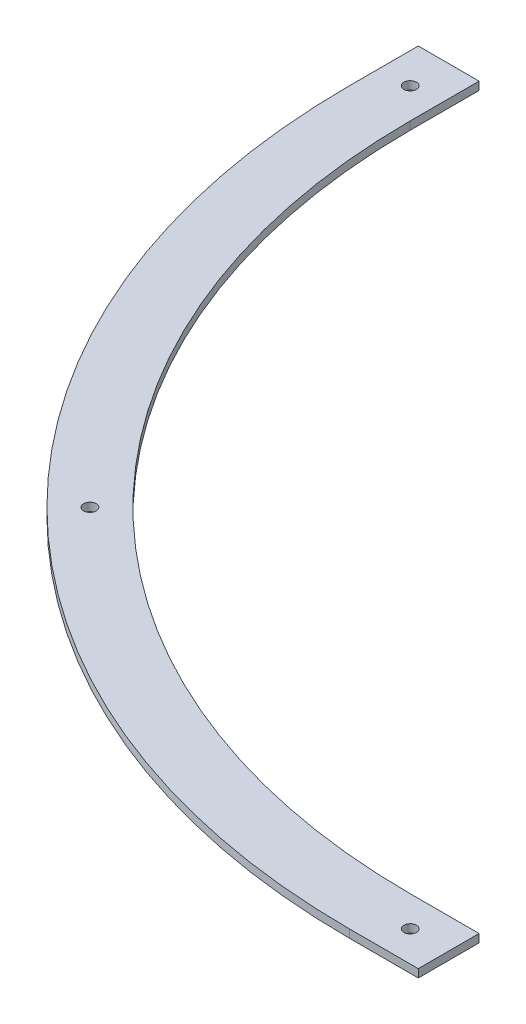
ISO-10303-21;
HEADER;
FILE_DESCRIPTION(('STEP AP214'),'2;1');
FILE_NAME('part.step','',(''),(''),'','','');
FILE_SCHEMA(('AUTOMOTIVE_DESIGN { 1 0 10303 214 1 1 1 1 }'));
ENDSEC;
DATA;
#1=APPLICATION_CONTEXT('core data for automotive mechanical design processes');
#2=APPLICATION_PROTOCOL_DEFINITION('international standard','automotive_design',2000,#1);
#3=PRODUCT_CONTEXT('',#1,'mechanical');
#4=PRODUCT('Part','Part','',(#3));
#5=PRODUCT_RELATED_PRODUCT_CATEGORY('part','',(#4));
#6=PRODUCT_DEFINITION_FORMATION('','',#4);
#7=PRODUCT_DEFINITION_CONTEXT('part definition',#1,'design');
#8=PRODUCT_DEFINITION('design','',#6,#7);
#9=PRODUCT_DEFINITION_SHAPE('','',#8);
#10=(LENGTH_UNIT() NAMED_UNIT(*) SI_UNIT(.MILLI.,.METRE.));
#11=(NAMED_UNIT(*) PLANE_ANGLE_UNIT() SI_UNIT($,.RADIAN.));
#12=(NAMED_UNIT(*) SI_UNIT($,.STERADIAN.) SOLID_ANGLE_UNIT());
#13=UNCERTAINTY_MEASURE_WITH_UNIT(LENGTH_MEASURE(1.E-05),#10,'distance_accuracy_value','');
#14=(GEOMETRIC_REPRESENTATION_CONTEXT(3) GLOBAL_UNCERTAINTY_ASSIGNED_CONTEXT((#13)) GLOBAL_UNIT_ASSIGNED_CONTEXT((#10,
#11,#12)) REPRESENTATION_CONTEXT('',''));
#15=CARTESIAN_POINT('',(0.,0.,0.));
#16=DIRECTION('',(0.,0.,1.));
#17=DIRECTION('',(1.,0.,0.));
#18=AXIS2_PLACEMENT_3D('',#15,#16,#17);
#19=CARTESIAN_POINT('',(90.,2.,-90.));
#20=DIRECTION('',(0.,1.,0.));
#21=DIRECTION('',(0.,0.,1.));
#22=AXIS2_PLACEMENT_3D('',#19,#20,#21);
#23=PLANE('',#22);
#24=CARTESIAN_POINT('',(97.5,2.,82.5));
#25=DIRECTION('',(0.,1.,0.));
#26=DIRECTION('',(0.,0.,1.));
#27=AXIS2_PLACEMENT_3D('',#24,#25,#26);
#28=CIRCLE('',#27,1.54999999999999);
#29=CARTESIAN_POINT('',(97.5,2.,84.05));
#30=VERTEX_POINT('',#29);
#31=EDGE_CURVE('E185',#30,#30,#28,.T.);
#32=ORIENTED_EDGE('',*,*,#31,.F.);
#33=EDGE_LOOP('',(#32));
#34=FACE_BOUND('',#33,.T.);
#35=CARTESIAN_POINT('',(90.,2.,-90.));
#36=DIRECTION('',(0.,1.,0.));
#37=DIRECTION('',(0.,0.,1.));
#38=AXIS2_PLACEMENT_3D('',#35,#36,#37);
#39=CIRCLE('',#38,180.);
#40=CARTESIAN_POINT('',(-90.,2.,-90.));
#41=VERTEX_POINT('',#40);
#42=CARTESIAN_POINT('',(90.,2.,90.));
#43=VERTEX_POINT('',#42);
#44=EDGE_CURVE('E148',#41,#43,#39,.T.);
#45=ORIENTED_EDGE('',*,*,#44,.T.);
#46=DIRECTION('',(1.,0.,0.));
#47=VECTOR('',#46,1.);
#48=CARTESIAN_POINT('',(90.,2.,90.));
#49=LINE('',#48,#47);
#50=CARTESIAN_POINT('',(107.,2.,90.));
#51=VERTEX_POINT('',#50);
#52=EDGE_CURVE('E96',#43,#51,#49,.T.);
#53=ORIENTED_EDGE('',*,*,#52,.T.);
#54=DIRECTION('',(0.,0.,-1.));
#55=VECTOR('',#54,1.);
#56=CARTESIAN_POINT('',(107.,2.,75.));
#57=LINE('',#56,#55);
#58=CARTESIAN_POINT('',(107.,2.,75.));
#59=VERTEX_POINT('',#58);
#60=EDGE_CURVE('E163',#51,#59,#57,.T.);
#61=ORIENTED_EDGE('',*,*,#60,.T.);
#62=DIRECTION('',(-1.,0.,0.));
#63=VECTOR('',#62,1.);
#64=CARTESIAN_POINT('',(90.,2.,75.));
#65=LINE('',#64,#63);
#66=CARTESIAN_POINT('',(90.,2.,75.));
#67=VERTEX_POINT('',#66);
#68=EDGE_CURVE('E176',#59,#67,#65,.T.);
#69=ORIENTED_EDGE('',*,*,#68,.T.);
#70=CARTESIAN_POINT('',(90.,2.,-90.));
#71=DIRECTION('',(0.,-1.,0.));
#72=DIRECTION('',(0.,0.,1.));
#73=AXIS2_PLACEMENT_3D('',#70,#71,#72);
#74=CIRCLE('',#73,165.);
#75=CARTESIAN_POINT('',(-75.,2.,-90.));
#76=VERTEX_POINT('',#75);
#77=EDGE_CURVE('E115',#67,#76,#74,.T.);
#78=ORIENTED_EDGE('',*,*,#77,.T.);
#79=DIRECTION('',(0.,0.,-1.));
#80=VECTOR('',#79,1.);
#81=CARTESIAN_POINT('',(-75.,2.,-90.));
#82=LINE('',#81,#80);
#83=CARTESIAN_POINT('',(-75.,2.,-107.));
#84=VERTEX_POINT('',#83);
#85=EDGE_CURVE('E109',#76,#84,#82,.T.);
#86=ORIENTED_EDGE('',*,*,#85,.T.);
#87=DIRECTION('',(-1.,0.,0.));
#88=VECTOR('',#87,1.);
#89=CARTESIAN_POINT('',(-90.,2.,-107.));
#90=LINE('',#89,#88);
#91=CARTESIAN_POINT('',(-90.,2.,-107.));
#92=VERTEX_POINT('',#91);
#93=EDGE_CURVE('E113',#84,#92,#90,.T.);
#94=ORIENTED_EDGE('',*,*,#93,.T.);
#95=DIRECTION('',(0.,0.,1.));
#96=VECTOR('',#95,1.);
#97=CARTESIAN_POINT('',(-90.,2.,-90.));
#98=LINE('',#97,#96);
#99=EDGE_CURVE('E53',#92,#41,#98,.T.);
#100=ORIENTED_EDGE('',*,*,#99,.T.);
#101=EDGE_LOOP('',(#45,#53,#61,#69,#78,#86,#94,#100));
#102=FACE_BOUND('',#101,.T.);
#103=CARTESIAN_POINT('',(-82.5,2.,-97.5));
#104=DIRECTION('',(0.,1.,0.));
#105=DIRECTION('',(0.,0.,1.));
#106=AXIS2_PLACEMENT_3D('',#103,#104,#105);
#107=CIRCLE('',#106,1.54999999999999);
#108=CARTESIAN_POINT('',(-82.5,2.,-95.95));
#109=VERTEX_POINT('',#108);
#110=EDGE_CURVE('E137',#109,#109,#107,.T.);
#111=ORIENTED_EDGE('',*,*,#110,.F.);
#112=EDGE_LOOP('',(#111));
#113=FACE_BOUND('',#112,.T.);
#114=CARTESIAN_POINT('',(-31.9759197546794,2.,31.9759197546794));
#115=DIRECTION('',(0.,1.,0.));
#116=DIRECTION('',(0.,0.,1.));
#117=AXIS2_PLACEMENT_3D('',#114,#115,#116);
#118=CIRCLE('',#117,1.54999999999999);
#119=CARTESIAN_POINT('',(-31.9759197546794,2.,33.5259197546794));
#120=VERTEX_POINT('',#119);
#121=EDGE_CURVE('E191',#120,#120,#118,.T.);
#122=ORIENTED_EDGE('',*,*,#121,.F.);
#123=EDGE_LOOP('',(#122));
#124=FACE_BOUND('',#123,.T.);
#125=ADVANCED_FACE('F36',(#34,#102,#113,#124),#23,.T.);
#126=CARTESIAN_POINT('',(90.,0.,-90.));
#127=DIRECTION('',(0.,1.,0.));
#128=DIRECTION('',(0.,0.,1.));
#129=AXIS2_PLACEMENT_3D('',#126,#127,#128);
#130=PLANE('',#129);
#131=CARTESIAN_POINT('',(90.,0.,-90.));
#132=DIRECTION('',(0.,1.,0.));
#133=DIRECTION('',(0.,0.,1.));
#134=AXIS2_PLACEMENT_3D('',#131,#132,#133);
#135=CIRCLE('',#134,180.);
#136=CARTESIAN_POINT('',(-90.,0.,-90.));
#137=VERTEX_POINT('',#136);
#138=CARTESIAN_POINT('',(90.,0.,90.));
#139=VERTEX_POINT('',#138);
#140=EDGE_CURVE('E133',#137,#139,#135,.T.);
#141=ORIENTED_EDGE('',*,*,#140,.F.);
#142=DIRECTION('',(0.,0.,1.));
#143=VECTOR('',#142,1.);
#144=CARTESIAN_POINT('',(-90.,0.,-90.));
#145=LINE('',#144,#143);
#146=CARTESIAN_POINT('',(-90.,0.,-107.));
#147=VERTEX_POINT('',#146);
#148=EDGE_CURVE('E88',#147,#137,#145,.T.);
#149=ORIENTED_EDGE('',*,*,#148,.F.);
#150=DIRECTION('',(-1.,0.,0.));
#151=VECTOR('',#150,1.);
#152=CARTESIAN_POINT('',(-90.,0.,-107.));
#153=LINE('',#152,#151);
#154=CARTESIAN_POINT('',(-75.,0.,-107.));
#155=VERTEX_POINT('',#154);
#156=EDGE_CURVE('E82',#155,#147,#153,.T.);
#157=ORIENTED_EDGE('',*,*,#156,.F.);
#158=DIRECTION('',(0.,0.,-1.));
#159=VECTOR('',#158,1.);
#160=CARTESIAN_POINT('',(-75.,0.,-90.));
#161=LINE('',#160,#159);
#162=CARTESIAN_POINT('',(-75.,0.,-90.));
#163=VERTEX_POINT('',#162);
#164=EDGE_CURVE('E123',#163,#155,#161,.T.);
#165=ORIENTED_EDGE('',*,*,#164,.F.);
#166=CARTESIAN_POINT('',(90.,0.,-90.));
#167=DIRECTION('',(0.,-1.,0.));
#168=DIRECTION('',(0.,0.,1.));
#169=AXIS2_PLACEMENT_3D('',#166,#167,#168);
#170=CIRCLE('',#169,165.);
#171=CARTESIAN_POINT('',(90.,0.,75.));
#172=VERTEX_POINT('',#171);
#173=EDGE_CURVE('E143',#172,#163,#170,.T.);
#174=ORIENTED_EDGE('',*,*,#173,.F.);
#175=DIRECTION('',(-1.,0.,0.));
#176=VECTOR('',#175,1.);
#177=CARTESIAN_POINT('',(90.,0.,75.));
#178=LINE('',#177,#176);
#179=CARTESIAN_POINT('',(107.,0.,75.));
#180=VERTEX_POINT('',#179);
#181=EDGE_CURVE('E141',#180,#172,#178,.T.);
#182=ORIENTED_EDGE('',*,*,#181,.F.);
#183=DIRECTION('',(0.,0.,-1.));
#184=VECTOR('',#183,1.);
#185=CARTESIAN_POINT('',(107.,0.,75.));
#186=LINE('',#185,#184);
#187=CARTESIAN_POINT('',(107.,0.,90.));
#188=VERTEX_POINT('',#187);
#189=EDGE_CURVE('E139',#188,#180,#186,.T.);
#190=ORIENTED_EDGE('',*,*,#189,.F.);
#191=DIRECTION('',(1.,0.,0.));
#192=VECTOR('',#191,1.);
#193=CARTESIAN_POINT('',(90.,0.,90.));
#194=LINE('',#193,#192);
#195=EDGE_CURVE('E136',#139,#188,#194,.T.);
#196=ORIENTED_EDGE('',*,*,#195,.F.);
#197=EDGE_LOOP('',(#141,#149,#157,#165,#174,#182,#190,#196));
#198=FACE_BOUND('',#197,.T.);
#199=CARTESIAN_POINT('',(-82.5,0.,-97.5));
#200=DIRECTION('',(0.,1.,0.));
#201=DIRECTION('',(0.,0.,1.));
#202=AXIS2_PLACEMENT_3D('',#199,#200,#201);
#203=CIRCLE('',#202,1.54999999999999);
#204=CARTESIAN_POINT('',(-82.5,0.,-95.95));
#205=VERTEX_POINT('',#204);
#206=EDGE_CURVE('E182',#205,#205,#203,.T.);
#207=ORIENTED_EDGE('',*,*,#206,.T.);
#208=EDGE_LOOP('',(#207));
#209=FACE_BOUND('',#208,.T.);
#210=CARTESIAN_POINT('',(97.5,0.,82.5));
#211=DIRECTION('',(0.,1.,0.));
#212=DIRECTION('',(0.,0.,1.));
#213=AXIS2_PLACEMENT_3D('',#210,#211,#212);
#214=CIRCLE('',#213,1.54999999999999);
#215=CARTESIAN_POINT('',(97.5,0.,84.05));
#216=VERTEX_POINT('',#215);
#217=EDGE_CURVE('E188',#216,#216,#214,.T.);
#218=ORIENTED_EDGE('',*,*,#217,.T.);
#219=EDGE_LOOP('',(#218));
#220=FACE_BOUND('',#219,.T.);
#221=CARTESIAN_POINT('',(-31.9759197546794,0.,31.9759197546794));
#222=DIRECTION('',(0.,1.,0.));
#223=DIRECTION('',(0.,0.,1.));
#224=AXIS2_PLACEMENT_3D('',#221,#222,#223);
#225=CIRCLE('',#224,1.54999999999999);
#226=CARTESIAN_POINT('',(-31.9759197546794,0.,33.5259197546794));
#227=VERTEX_POINT('',#226);
#228=EDGE_CURVE('E194',#227,#227,#225,.T.);
#229=ORIENTED_EDGE('',*,*,#228,.T.);
#230=EDGE_LOOP('',(#229));
#231=FACE_BOUND('',#230,.T.);
#232=ADVANCED_FACE('F167',(#198,#209,#220,#231),#130,.F.);
#233=CARTESIAN_POINT('',(90.,2.,-90.));
#234=DIRECTION('',(0.,-1.,0.));
#235=DIRECTION('',(0.,0.,-1.));
#236=AXIS2_PLACEMENT_3D('',#233,#234,#235);
#237=CYLINDRICAL_SURFACE('',#236,180.);
#238=ORIENTED_EDGE('',*,*,#140,.T.);
#239=DIRECTION('',(0.,-1.,0.));
#240=VECTOR('',#239,1.);
#241=CARTESIAN_POINT('',(90.,2.,90.));
#242=LINE('',#241,#240);
#243=EDGE_CURVE('E11',#43,#139,#242,.T.);
#244=ORIENTED_EDGE('',*,*,#243,.F.);
#245=ORIENTED_EDGE('',*,*,#44,.F.);
#246=DIRECTION('',(0.,-1.,0.));
#247=VECTOR('',#246,1.);
#248=CARTESIAN_POINT('',(-90.,2.,-90.));
#249=LINE('',#248,#247);
#250=EDGE_CURVE('E129',#41,#137,#249,.T.);
#251=ORIENTED_EDGE('',*,*,#250,.T.);
#252=EDGE_LOOP('',(#238,#244,#245,#251));
#253=FACE_BOUND('',#252,.T.);
#254=ADVANCED_FACE('F38',(#253),#237,.T.);
#255=CARTESIAN_POINT('',(90.,2.,90.));
#256=DIRECTION('',(0.,0.,-1.));
#257=DIRECTION('',(-1.,0.,0.));
#258=AXIS2_PLACEMENT_3D('',#255,#256,#257);
#259=PLANE('',#258);
#260=ORIENTED_EDGE('',*,*,#195,.T.);
#261=DIRECTION('',(0.,-1.,0.));
#262=VECTOR('',#261,1.);
#263=CARTESIAN_POINT('',(107.,2.,90.));
#264=LINE('',#263,#262);
#265=EDGE_CURVE('E45',#51,#188,#264,.T.);
#266=ORIENTED_EDGE('',*,*,#265,.F.);
#267=ORIENTED_EDGE('',*,*,#52,.F.);
#268=ORIENTED_EDGE('',*,*,#243,.T.);
#269=EDGE_LOOP('',(#260,#266,#267,#268));
#270=FACE_BOUND('',#269,.T.);
#271=ADVANCED_FACE('F227',(#270),#259,.F.);
#272=CARTESIAN_POINT('',(107.,2.,75.));
#273=DIRECTION('',(-1.,0.,0.));
#274=DIRECTION('',(0.,0.,1.));
#275=AXIS2_PLACEMENT_3D('',#272,#273,#274);
#276=PLANE('',#275);
#277=ORIENTED_EDGE('',*,*,#189,.T.);
#278=DIRECTION('',(0.,-1.,0.));
#279=VECTOR('',#278,1.);
#280=CARTESIAN_POINT('',(107.,2.,75.));
#281=LINE('',#280,#279);
#282=EDGE_CURVE('E155',#59,#180,#281,.T.);
#283=ORIENTED_EDGE('',*,*,#282,.F.);
#284=ORIENTED_EDGE('',*,*,#60,.F.);
#285=ORIENTED_EDGE('',*,*,#265,.T.);
#286=EDGE_LOOP('',(#277,#283,#284,#285));
#287=FACE_BOUND('',#286,.T.);
#288=ADVANCED_FACE('F161',(#287),#276,.F.);
#289=CARTESIAN_POINT('',(90.,2.,75.));
#290=DIRECTION('',(0.,0.,1.));
#291=DIRECTION('',(1.,0.,0.));
#292=AXIS2_PLACEMENT_3D('',#289,#290,#291);
#293=PLANE('',#292);
#294=ORIENTED_EDGE('',*,*,#181,.T.);
#295=DIRECTION('',(0.,-1.,0.));
#296=VECTOR('',#295,1.);
#297=CARTESIAN_POINT('',(90.,2.,75.));
#298=LINE('',#297,#296);
#299=EDGE_CURVE('E152',#67,#172,#298,.T.);
#300=ORIENTED_EDGE('',*,*,#299,.F.);
#301=ORIENTED_EDGE('',*,*,#68,.F.);
#302=ORIENTED_EDGE('',*,*,#282,.T.);
#303=EDGE_LOOP('',(#294,#300,#301,#302));
#304=FACE_BOUND('',#303,.T.);
#305=ADVANCED_FACE('F172',(#304),#293,.F.);
#306=CARTESIAN_POINT('',(90.,2.,-90.));
#307=DIRECTION('',(0.,-1.,0.));
#308=DIRECTION('',(0.,0.,-1.));
#309=AXIS2_PLACEMENT_3D('',#306,#307,#308);
#310=CYLINDRICAL_SURFACE('',#309,165.);
#311=ORIENTED_EDGE('',*,*,#173,.T.);
#312=DIRECTION('',(0.,-1.,0.));
#313=VECTOR('',#312,1.);
#314=CARTESIAN_POINT('',(-75.,2.,-90.));
#315=LINE('',#314,#313);
#316=EDGE_CURVE('E124',#76,#163,#315,.T.);
#317=ORIENTED_EDGE('',*,*,#316,.F.);
#318=ORIENTED_EDGE('',*,*,#77,.F.);
#319=ORIENTED_EDGE('',*,*,#299,.T.);
#320=EDGE_LOOP('',(#311,#317,#318,#319));
#321=FACE_BOUND('',#320,.T.);
#322=ADVANCED_FACE('F175',(#321),#310,.F.);
#323=CARTESIAN_POINT('',(-75.,2.,-90.));
#324=DIRECTION('',(-1.,0.,0.));
#325=DIRECTION('',(0.,0.,1.));
#326=AXIS2_PLACEMENT_3D('',#323,#324,#325);
#327=PLANE('',#326);
#328=ORIENTED_EDGE('',*,*,#164,.T.);
#329=DIRECTION('',(0.,-1.,0.));
#330=VECTOR('',#329,1.);
#331=CARTESIAN_POINT('',(-75.,2.,-107.));
#332=LINE('',#331,#330);
#333=EDGE_CURVE('E120',#84,#155,#332,.T.);
#334=ORIENTED_EDGE('',*,*,#333,.F.);
#335=ORIENTED_EDGE('',*,*,#85,.F.);
#336=ORIENTED_EDGE('',*,*,#316,.T.);
#337=EDGE_LOOP('',(#328,#334,#335,#336));
#338=FACE_BOUND('',#337,.T.);
#339=ADVANCED_FACE('F121',(#338),#327,.F.);
#340=CARTESIAN_POINT('',(-90.,2.,-107.));
#341=DIRECTION('',(0.,0.,1.));
#342=DIRECTION('',(1.,0.,0.));
#343=AXIS2_PLACEMENT_3D('',#340,#341,#342);
#344=PLANE('',#343);
#345=ORIENTED_EDGE('',*,*,#156,.T.);
#346=DIRECTION('',(0.,-1.,0.));
#347=VECTOR('',#346,1.);
#348=CARTESIAN_POINT('',(-90.,2.,-107.));
#349=LINE('',#348,#347);
#350=EDGE_CURVE('E125',#92,#147,#349,.T.);
#351=ORIENTED_EDGE('',*,*,#350,.F.);
#352=ORIENTED_EDGE('',*,*,#93,.F.);
#353=ORIENTED_EDGE('',*,*,#333,.T.);
#354=EDGE_LOOP('',(#345,#351,#352,#353));
#355=FACE_BOUND('',#354,.T.);
#356=ADVANCED_FACE('F127',(#355),#344,.F.);
#357=CARTESIAN_POINT('',(-90.,2.,-90.));
#358=DIRECTION('',(1.,0.,0.));
#359=DIRECTION('',(0.,0.,-1.));
#360=AXIS2_PLACEMENT_3D('',#357,#358,#359);
#361=PLANE('',#360);
#362=ORIENTED_EDGE('',*,*,#148,.T.);
#363=ORIENTED_EDGE('',*,*,#250,.F.);
#364=ORIENTED_EDGE('',*,*,#99,.F.);
#365=ORIENTED_EDGE('',*,*,#350,.T.);
#366=EDGE_LOOP('',(#362,#363,#364,#365));
#367=FACE_BOUND('',#366,.T.);
#368=ADVANCED_FACE('F215',(#367),#361,.F.);
#369=CARTESIAN_POINT('',(-82.5,2.,-97.5));
#370=DIRECTION('',(0.,-1.,0.));
#371=DIRECTION('',(0.,0.,-1.));
#372=AXIS2_PLACEMENT_3D('',#369,#370,#371);
#373=CYLINDRICAL_SURFACE('',#372,1.54999999999999);
#374=ORIENTED_EDGE('',*,*,#110,.T.);
#375=EDGE_LOOP('',(#374));
#376=FACE_BOUND('',#375,.T.);
#377=ORIENTED_EDGE('',*,*,#206,.F.);
#378=EDGE_LOOP('',(#377));
#379=FACE_BOUND('',#378,.T.);
#380=ADVANCED_FACE('F212',(#376,#379),#373,.F.);
#381=CARTESIAN_POINT('',(97.5,2.,82.5));
#382=DIRECTION('',(0.,-1.,0.));
#383=DIRECTION('',(0.,0.,-1.));
#384=AXIS2_PLACEMENT_3D('',#381,#382,#383);
#385=CYLINDRICAL_SURFACE('',#384,1.54999999999999);
#386=ORIENTED_EDGE('',*,*,#31,.T.);
#387=EDGE_LOOP('',(#386));
#388=FACE_BOUND('',#387,.T.);
#389=ORIENTED_EDGE('',*,*,#217,.F.);
#390=EDGE_LOOP('',(#389));
#391=FACE_BOUND('',#390,.T.);
#392=ADVANCED_FACE('F291',(#388,#391),#385,.F.);
#393=CARTESIAN_POINT('',(-31.9759197546794,2.,31.9759197546794));
#394=DIRECTION('',(0.,-1.,0.));
#395=DIRECTION('',(0.,0.,-1.));
#396=AXIS2_PLACEMENT_3D('',#393,#394,#395);
#397=CYLINDRICAL_SURFACE('',#396,1.54999999999999);
#398=ORIENTED_EDGE('',*,*,#121,.T.);
#399=EDGE_LOOP('',(#398));
#400=FACE_BOUND('',#399,.T.);
#401=ORIENTED_EDGE('',*,*,#228,.F.);
#402=EDGE_LOOP('',(#401));
#403=FACE_BOUND('',#402,.T.);
#404=ADVANCED_FACE('F200',(#400,#403),#397,.F.);
#405=CLOSED_SHELL('',(#125,#232,#254,#271,#288,#305,#322,#339,#356,#368,#380,#392,#404));
#406=MANIFOLD_SOLID_BREP('B2',#405);
#407=ADVANCED_BREP_SHAPE_REPRESENTATION('',(#18,#406),#14);
#408=SHAPE_DEFINITION_REPRESENTATION(#9,#407);
ENDSEC;
END-ISO-10303-21;
